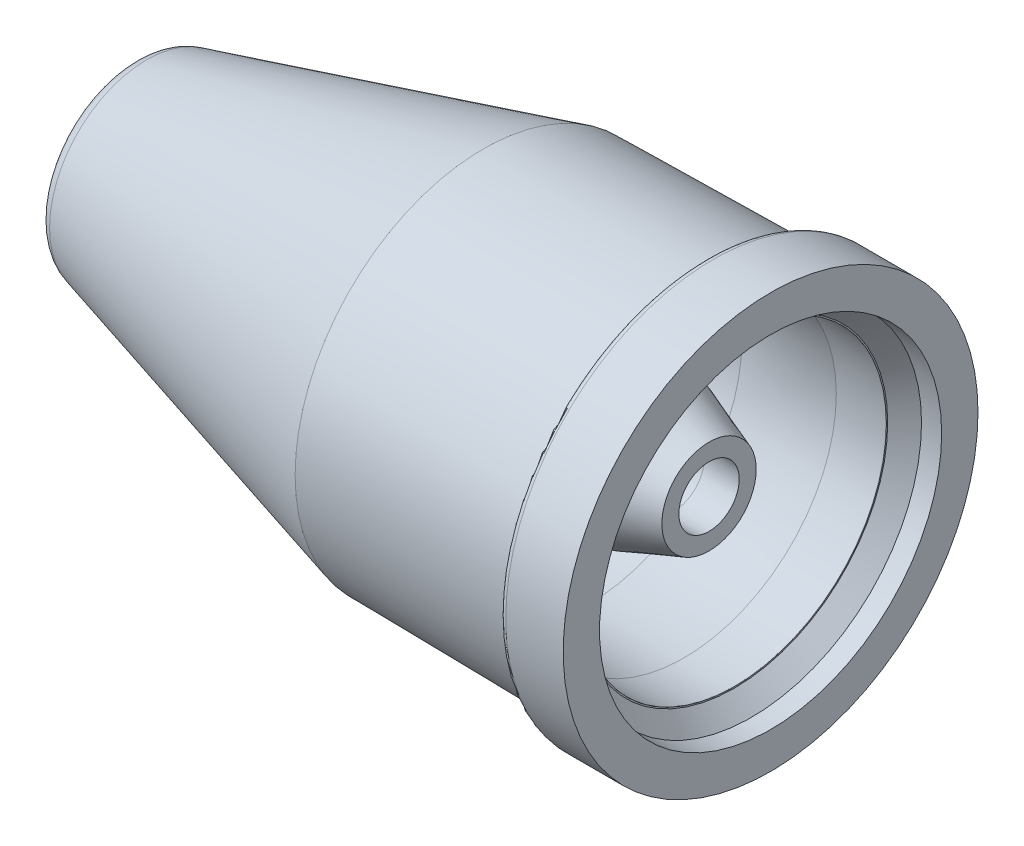
ISO-10303-21;
HEADER;
FILE_DESCRIPTION(('STEP AP214'),'2;1');
FILE_NAME('part.step','',(''),(''),'','','');
FILE_SCHEMA(('AUTOMOTIVE_DESIGN { 1 0 10303 214 1 1 1 1 }'));
ENDSEC;
DATA;
#1=APPLICATION_CONTEXT('core data for automotive mechanical design processes');
#2=APPLICATION_PROTOCOL_DEFINITION('international standard','automotive_design',2000,#1);
#3=PRODUCT_CONTEXT('',#1,'mechanical');
#4=PRODUCT('Part','Part','',(#3));
#5=PRODUCT_RELATED_PRODUCT_CATEGORY('part','',(#4));
#6=PRODUCT_DEFINITION_FORMATION('','',#4);
#7=PRODUCT_DEFINITION_CONTEXT('part definition',#1,'design');
#8=PRODUCT_DEFINITION('design','',#6,#7);
#9=PRODUCT_DEFINITION_SHAPE('','',#8);
#10=(LENGTH_UNIT() NAMED_UNIT(*) SI_UNIT(.MILLI.,.METRE.));
#11=(NAMED_UNIT(*) PLANE_ANGLE_UNIT() SI_UNIT($,.RADIAN.));
#12=(NAMED_UNIT(*) SI_UNIT($,.STERADIAN.) SOLID_ANGLE_UNIT());
#13=UNCERTAINTY_MEASURE_WITH_UNIT(LENGTH_MEASURE(1.E-05),#10,'distance_accuracy_value','');
#14=(GEOMETRIC_REPRESENTATION_CONTEXT(3) GLOBAL_UNCERTAINTY_ASSIGNED_CONTEXT((#13)) GLOBAL_UNIT_ASSIGNED_CONTEXT((#10,
#11,#12)) REPRESENTATION_CONTEXT('',''));
#15=CARTESIAN_POINT('',(0.,0.,0.));
#16=DIRECTION('',(0.,0.,1.));
#17=DIRECTION('',(1.,0.,0.));
#18=AXIS2_PLACEMENT_3D('',#15,#16,#17);
#19=CARTESIAN_POINT('',(-4.87868723113727,0.,0.));
#20=DIRECTION('',(1.,0.,0.));
#21=DIRECTION('',(0.,0.,-1.));
#22=AXIS2_PLACEMENT_3D('',#19,#20,#21);
#23=CONICAL_SURFACE('',#22,2.32622761535942,0.0125432445241696);
#24=CARTESIAN_POINT('',(-0.634642356137269,0.,0.));
#25=DIRECTION('',(1.,0.,0.));
#26=DIRECTION('',(0.,0.,-1.));
#27=AXIS2_PLACEMENT_3D('',#24,#25,#26);
#28=CIRCLE('',#27,2.3794645);
#29=CARTESIAN_POINT('',(-0.634642356137269,0.,-2.3794645));
#30=VERTEX_POINT('',#29);
#31=EDGE_CURVE('E468',#30,#30,#28,.T.);
#32=ORIENTED_EDGE('',*,*,#31,.T.);
#33=EDGE_LOOP('',(#32));
#34=FACE_BOUND('',#33,.T.);
#35=CARTESIAN_POINT('',(-0.640254310505665,0.,0.));
#36=DIRECTION('',(-1.,0.,0.));
#37=DIRECTION('',(0.,0.,1.));
#38=AXIS2_PLACEMENT_3D('',#35,#36,#37);
#39=CIRCLE('',#38,2.3793941041922);
#40=CARTESIAN_POINT('',(-0.640254310505665,0.,2.3793941041922));
#41=VERTEX_POINT('',#40);
#42=EDGE_CURVE('E441',#41,#41,#39,.T.);
#43=ORIENTED_EDGE('',*,*,#42,.T.);
#44=EDGE_LOOP('',(#43));
#45=FACE_BOUND('',#44,.T.);
#46=ADVANCED_FACE('F38',(#34,#45),#23,.F.);
#47=CARTESIAN_POINT('',(-1.59707987349605,0.,0.));
#48=DIRECTION('',(-1.,0.,0.));
#49=DIRECTION('',(0.,0.,1.));
#50=AXIS2_PLACEMENT_3D('',#47,#48,#49);
#51=CONICAL_SURFACE('',#50,0.492499997562125,0.0349065850398794);
#52=CARTESIAN_POINT('',(-1.59707987349605,0.,0.));
#53=DIRECTION('',(1.,0.,0.));
#54=DIRECTION('',(0.,0.,-1.));
#55=AXIS2_PLACEMENT_3D('',#52,#53,#54);
#56=CIRCLE('',#55,0.492499997562125);
#57=CARTESIAN_POINT('',(-1.59707987349605,0.,-0.492499997562125));
#58=VERTEX_POINT('',#57);
#59=EDGE_CURVE('E467',#58,#58,#56,.T.);
#60=ORIENTED_EDGE('',*,*,#59,.F.);
#61=EDGE_LOOP('',(#60));
#62=FACE_BOUND('',#61,.T.);
#63=CARTESIAN_POINT('',(-1.03428148113727,0.,0.));
#64=DIRECTION('',(1.,0.,0.));
#65=DIRECTION('',(0.,0.,-1.));
#66=AXIS2_PLACEMENT_3D('',#63,#64,#65);
#67=CIRCLE('',#66,0.472846644632242);
#68=CARTESIAN_POINT('',(-1.03428148113727,0.,-0.472846644632242));
#69=VERTEX_POINT('',#68);
#70=EDGE_CURVE('E438',#69,#69,#67,.T.);
#71=ORIENTED_EDGE('',*,*,#70,.T.);
#72=EDGE_LOOP('',(#71));
#73=FACE_BOUND('',#72,.T.);
#74=ADVANCED_FACE('F40',(#62,#73),#51,.F.);
#75=CARTESIAN_POINT('',(-10.0675194811373,1.4596387673665,0.));
#76=DIRECTION('',(-1.,0.,0.));
#77=DIRECTION('',(0.,0.,1.));
#78=AXIS2_PLACEMENT_3D('',#75,#76,#77);
#79=PLANE('',#78);
#80=CARTESIAN_POINT('',(-10.0675194811373,0.,0.));
#81=DIRECTION('',(-1.,0.,0.));
#82=DIRECTION('',(0.,0.,1.));
#83=AXIS2_PLACEMENT_3D('',#80,#81,#82);
#84=CIRCLE('',#83,1.23019086783449);
#85=CARTESIAN_POINT('',(-10.0675194811373,0.,1.23019086783449));
#86=VERTEX_POINT('',#85);
#87=EDGE_CURVE('E430',#86,#86,#84,.T.);
#88=ORIENTED_EDGE('',*,*,#87,.T.);
#89=EDGE_LOOP('',(#88));
#90=FACE_BOUND('',#89,.T.);
#91=CARTESIAN_POINT('',(-10.0675194811373,0.,0.));
#92=DIRECTION('',(1.,0.,0.));
#93=DIRECTION('',(0.,0.,-1.));
#94=AXIS2_PLACEMENT_3D('',#91,#92,#93);
#95=CIRCLE('',#94,1.18173405);
#96=CARTESIAN_POINT('',(-10.0675194811373,0.,-1.18173405));
#97=VERTEX_POINT('',#96);
#98=EDGE_CURVE('E58',#97,#97,#95,.T.);
#99=ORIENTED_EDGE('',*,*,#98,.T.);
#100=EDGE_LOOP('',(#99));
#101=FACE_BOUND('',#100,.T.);
#102=ADVANCED_FACE('F104',(#90,#101),#79,.T.);
#103=CARTESIAN_POINT('',(-4.56875698113727,0.,0.));
#104=DIRECTION('',(1.,0.,0.));
#105=DIRECTION('',(0.,0.,-1.));
#106=AXIS2_PLACEMENT_3D('',#103,#104,#105);
#107=CONICAL_SURFACE('',#106,2.950336025,0.264733885681429);
#108=CARTESIAN_POINT('',(-9.84606504978164,0.,0.));
#109=DIRECTION('',(-1.,0.,0.));
#110=DIRECTION('',(0.,0.,1.));
#111=AXIS2_PLACEMENT_3D('',#108,#109,#110);
#112=CIRCLE('',#111,1.51967436874274);
#113=CARTESIAN_POINT('',(-9.84606504978164,0.,1.51967436874274));
#114=VERTEX_POINT('',#113);
#115=EDGE_CURVE('E434',#114,#114,#112,.F.);
#116=ORIENTED_EDGE('',*,*,#115,.T.);
#117=EDGE_LOOP('',(#116));
#118=FACE_BOUND('',#117,.T.);
#119=CARTESIAN_POINT('',(-4.56875698113727,0.,0.));
#120=DIRECTION('',(1.,0.,0.));
#121=DIRECTION('',(0.,0.,-1.));
#122=AXIS2_PLACEMENT_3D('',#119,#120,#121);
#123=CIRCLE('',#122,2.950336025);
#124=CARTESIAN_POINT('',(-4.56875698113727,0.,-2.950336025));
#125=VERTEX_POINT('',#124);
#126=EDGE_CURVE('E436',#125,#125,#123,.T.);
#127=ORIENTED_EDGE('',*,*,#126,.F.);
#128=EDGE_LOOP('',(#127));
#129=FACE_BOUND('',#128,.T.);
#130=ADVANCED_FACE('F374',(#118,#129),#107,.T.);
#131=CARTESIAN_POINT('',(-1.06954448113727,0.,0.));
#132=DIRECTION('',(1.,0.,0.));
#133=DIRECTION('',(0.,0.,-1.));
#134=AXIS2_PLACEMENT_3D('',#131,#132,#133);
#135=CONICAL_SURFACE('',#134,2.999325,0.0139990854408832);
#136=ORIENTED_EDGE('',*,*,#126,.T.);
#137=EDGE_LOOP('',(#136));
#138=FACE_BOUND('',#137,.T.);
#139=CARTESIAN_POINT('',(-1.06954448113727,0.,0.));
#140=DIRECTION('',(1.,0.,0.));
#141=DIRECTION('',(0.,0.,-1.));
#142=AXIS2_PLACEMENT_3D('',#139,#140,#141);
#143=CIRCLE('',#142,2.999325);
#144=CARTESIAN_POINT('',(-1.06954448113727,0.,-2.999325));
#145=VERTEX_POINT('',#144);
#146=EDGE_CURVE('E451',#145,#145,#143,.T.);
#147=ORIENTED_EDGE('',*,*,#146,.F.);
#148=EDGE_LOOP('',(#147));
#149=FACE_BOUND('',#148,.T.);
#150=ADVANCED_FACE('F364',(#138,#149),#135,.T.);
#151=CARTESIAN_POINT('',(-1.06954448113727,3.24926875,0.));
#152=DIRECTION('',(-1.,0.,0.));
#153=DIRECTION('',(0.,0.,1.));
#154=AXIS2_PLACEMENT_3D('',#151,#152,#153);
#155=PLANE('',#154);
#156=CARTESIAN_POINT('',(-1.06954448113727,0.,0.));
#157=DIRECTION('',(-1.,0.,0.));
#158=DIRECTION('',(0.,0.,1.));
#159=AXIS2_PLACEMENT_3D('',#156,#157,#158);
#160=CIRCLE('',#159,3.14929125);
#161=CARTESIAN_POINT('',(-1.06954448113727,0.,3.14929125));
#162=VERTEX_POINT('',#161);
#163=EDGE_CURVE('E450',#162,#162,#160,.T.);
#164=ORIENTED_EDGE('',*,*,#163,.T.);
#165=EDGE_LOOP('',(#164));
#166=FACE_BOUND('',#165,.T.);
#167=ORIENTED_EDGE('',*,*,#146,.T.);
#168=EDGE_LOOP('',(#167));
#169=FACE_BOUND('',#168,.T.);
#170=ADVANCED_FACE('F355',(#166,#169),#155,.T.);
#171=CARTESIAN_POINT('',(2.92955551886273,0.,0.));
#172=DIRECTION('',(1.,0.,0.));
#173=DIRECTION('',(0.,0.,-1.));
#174=AXIS2_PLACEMENT_3D('',#171,#172,#173);
#175=CYLINDRICAL_SURFACE('',#174,3.24926875);
#176=CARTESIAN_POINT('',(-0.969566981137271,0.,0.));
#177=DIRECTION('',(-1.,0.,0.));
#178=DIRECTION('',(0.,0.,1.));
#179=AXIS2_PLACEMENT_3D('',#176,#177,#178);
#180=CIRCLE('',#179,3.24926875);
#181=CARTESIAN_POINT('',(-0.969566981137271,0.,3.24926875));
#182=VERTEX_POINT('',#181);
#183=EDGE_CURVE('E444',#182,#182,#180,.F.);
#184=ORIENTED_EDGE('',*,*,#183,.T.);
#185=EDGE_LOOP('',(#184));
#186=FACE_BOUND('',#185,.T.);
#187=CARTESIAN_POINT('',(-0.0697694811372708,0.,0.));
#188=DIRECTION('',(1.,0.,0.));
#189=DIRECTION('',(0.,0.,-1.));
#190=AXIS2_PLACEMENT_3D('',#187,#188,#189);
#191=CIRCLE('',#190,3.24926875);
#192=CARTESIAN_POINT('',(-0.0697694811372708,0.,-3.24926875));
#193=VERTEX_POINT('',#192);
#194=EDGE_CURVE('E454',#193,#193,#191,.T.);
#195=ORIENTED_EDGE('',*,*,#194,.F.);
#196=EDGE_LOOP('',(#195));
#197=FACE_BOUND('',#196,.T.);
#198=ADVANCED_FACE('F346',(#186,#197),#175,.T.);
#199=CARTESIAN_POINT('',(-0.0697694811372708,2.68011917125981,0.));
#200=DIRECTION('',(1.,0.,0.));
#201=DIRECTION('',(0.,0.,-1.));
#202=AXIS2_PLACEMENT_3D('',#199,#200,#201);
#203=PLANE('',#202);
#204=ORIENTED_EDGE('',*,*,#194,.T.);
#205=EDGE_LOOP('',(#204));
#206=FACE_BOUND('',#205,.T.);
#207=CARTESIAN_POINT('',(-0.0697694811372708,0.,0.));
#208=DIRECTION('',(1.,0.,0.));
#209=DIRECTION('',(0.,0.,-1.));
#210=AXIS2_PLACEMENT_3D('',#207,#208,#209);
#211=CIRCLE('',#210,2.68011917125981);
#212=CARTESIAN_POINT('',(-0.0697694811372708,0.,-2.68011917125981));
#213=VERTEX_POINT('',#212);
#214=EDGE_CURVE('E457',#213,#213,#211,.T.);
#215=ORIENTED_EDGE('',*,*,#214,.F.);
#216=EDGE_LOOP('',(#215));
#217=FACE_BOUND('',#216,.T.);
#218=ADVANCED_FACE('F337',(#206,#217),#203,.T.);
#219=CARTESIAN_POINT('',(-0.369701981137271,0.,0.));
#220=DIRECTION('',(1.,0.,0.));
#221=DIRECTION('',(0.,0.,-1.));
#222=AXIS2_PLACEMENT_3D('',#219,#220,#221);
#223=CONICAL_SURFACE('',#222,2.664400375,0.052359877559822);
#224=ORIENTED_EDGE('',*,*,#214,.T.);
#225=EDGE_LOOP('',(#224));
#226=FACE_BOUND('',#225,.T.);
#227=CARTESIAN_POINT('',(-0.369701981137271,0.,0.));
#228=DIRECTION('',(1.,0.,0.));
#229=DIRECTION('',(0.,0.,-1.));
#230=AXIS2_PLACEMENT_3D('',#227,#228,#229);
#231=CIRCLE('',#230,2.664400375);
#232=CARTESIAN_POINT('',(-0.369701981137271,0.,-2.664400375));
#233=VERTEX_POINT('',#232);
#234=EDGE_CURVE('E460',#233,#233,#231,.T.);
#235=ORIENTED_EDGE('',*,*,#234,.F.);
#236=EDGE_LOOP('',(#235));
#237=FACE_BOUND('',#236,.T.);
#238=ADVANCED_FACE('F329',(#226,#237),#223,.F.);
#239=CARTESIAN_POINT('',(-0.369701981137271,0.,0.));
#240=DIRECTION('',(1.,0.,0.));
#241=DIRECTION('',(0.,0.,-1.));
#242=AXIS2_PLACEMENT_3D('',#239,#240,#241);
#243=CONICAL_SURFACE('',#242,2.664400375,0.785398163397452);
#244=CARTESIAN_POINT('',(-0.634642356137269,0.,0.));
#245=DIRECTION('',(1.,0.,0.));
#246=DIRECTION('',(0.,0.,-1.));
#247=AXIS2_PLACEMENT_3D('',#244,#245,#246);
#248=CIRCLE('',#247,2.39946);
#249=CARTESIAN_POINT('',(-0.634642356137269,0.,-2.39946));
#250=VERTEX_POINT('',#249);
#251=EDGE_CURVE('E463',#250,#250,#248,.T.);
#252=ORIENTED_EDGE('',*,*,#251,.F.);
#253=EDGE_LOOP('',(#252));
#254=FACE_BOUND('',#253,.T.);
#255=ORIENTED_EDGE('',*,*,#234,.T.);
#256=EDGE_LOOP('',(#255));
#257=FACE_BOUND('',#256,.T.);
#258=ADVANCED_FACE('F321',(#254,#257),#243,.F.);
#259=CARTESIAN_POINT('',(-0.634642356137269,2.3794645,0.));
#260=DIRECTION('',(1.,0.,0.));
#261=DIRECTION('',(0.,0.,-1.));
#262=AXIS2_PLACEMENT_3D('',#259,#260,#261);
#263=PLANE('',#262);
#264=ORIENTED_EDGE('',*,*,#251,.T.);
#265=EDGE_LOOP('',(#264));
#266=FACE_BOUND('',#265,.T.);
#267=ORIENTED_EDGE('',*,*,#31,.F.);
#268=EDGE_LOOP('',(#267));
#269=FACE_BOUND('',#268,.T.);
#270=ADVANCED_FACE('F110',(#266,#269),#263,.T.);
#271=CARTESIAN_POINT('',(2.92955551886273,0.,0.));
#272=DIRECTION('',(1.,0.,0.));
#273=DIRECTION('',(0.,0.,-1.));
#274=AXIS2_PLACEMENT_3D('',#271,#272,#273);
#275=CYLINDRICAL_SURFACE('',#274,0.492499997562125);
#276=ORIENTED_EDGE('',*,*,#59,.T.);
#277=EDGE_LOOP('',(#276));
#278=FACE_BOUND('',#277,.T.);
#279=CARTESIAN_POINT('',(-5.92066948113727,0.,0.));
#280=DIRECTION('',(1.,0.,0.));
#281=DIRECTION('',(0.,0.,-1.));
#282=AXIS2_PLACEMENT_3D('',#279,#280,#281);
#283=CIRCLE('',#282,0.492499997562125);
#284=CARTESIAN_POINT('',(-5.92066948113727,0.,-0.492499997562125));
#285=VERTEX_POINT('',#284);
#286=EDGE_CURVE('E475',#285,#285,#283,.T.);
#287=ORIENTED_EDGE('',*,*,#286,.F.);
#288=EDGE_LOOP('',(#287));
#289=FACE_BOUND('',#288,.T.);
#290=ADVANCED_FACE('F121',(#278,#289),#275,.F.);
#291=CARTESIAN_POINT('',(-5.92066948113727,0.761902991626599,0.));
#292=DIRECTION('',(-1.,0.,0.));
#293=DIRECTION('',(0.,0.,1.));
#294=AXIS2_PLACEMENT_3D('',#291,#292,#293);
#295=PLANE('',#294);
#296=ORIENTED_EDGE('',*,*,#286,.T.);
#297=EDGE_LOOP('',(#296));
#298=FACE_BOUND('',#297,.T.);
#299=CARTESIAN_POINT('',(-5.92066948113727,0.,0.));
#300=DIRECTION('',(1.,0.,0.));
#301=DIRECTION('',(0.,0.,-1.));
#302=AXIS2_PLACEMENT_3D('',#299,#300,#301);
#303=CIRCLE('',#302,0.761902991626599);
#304=CARTESIAN_POINT('',(-5.92066948113727,0.,-0.761902991626599));
#305=VERTEX_POINT('',#304);
#306=EDGE_CURVE('E478',#305,#305,#303,.T.);
#307=ORIENTED_EDGE('',*,*,#306,.F.);
#308=EDGE_LOOP('',(#307));
#309=FACE_BOUND('',#308,.T.);
#310=ADVANCED_FACE('F124',(#298,#309),#295,.T.);
#311=CARTESIAN_POINT('',(-6.02064698113727,0.,0.));
#312=DIRECTION('',(1.,0.,0.));
#313=DIRECTION('',(0.,0.,-1.));
#314=AXIS2_PLACEMENT_3D('',#311,#312,#313);
#315=TOROIDAL_SURFACE('',#314,0.761902991626599,0.0999774999999997);
#316=CARTESIAN_POINT('',(-6.01959910326342,0.,0.));
#317=DIRECTION('',(1.,0.,0.));
#318=DIRECTION('',(0.,0.,-1.));
#319=AXIS2_PLACEMENT_3D('',#316,#317,#318);
#320=CIRCLE('',#319,0.861875);
#321=CARTESIAN_POINT('',(-6.01959910326342,0.,-0.861875));
#322=VERTEX_POINT('',#321);
#323=EDGE_CURVE('E481',#322,#322,#320,.T.);
#324=ORIENTED_EDGE('',*,*,#323,.F.);
#325=EDGE_LOOP('',(#324));
#326=FACE_BOUND('',#325,.T.);
#327=ORIENTED_EDGE('',*,*,#306,.T.);
#328=EDGE_LOOP('',(#327));
#329=FACE_BOUND('',#328,.T.);
#330=ADVANCED_FACE('F128',(#326,#329),#315,.F.);
#331=CARTESIAN_POINT('',(-9.61583788113727,0.,0.));
#332=DIRECTION('',(-1.,0.,0.));
#333=DIRECTION('',(0.,0.,1.));
#334=AXIS2_PLACEMENT_3D('',#331,#332,#333);
#335=CONICAL_SURFACE('',#334,0.910919996875,0.0136370134458708);
#336=ORIENTED_EDGE('',*,*,#323,.T.);
#337=EDGE_LOOP('',(#336));
#338=FACE_BOUND('',#337,.T.);
#339=CARTESIAN_POINT('',(-9.61583788113727,0.,0.));
#340=DIRECTION('',(1.,0.,0.));
#341=DIRECTION('',(0.,0.,-1.));
#342=AXIS2_PLACEMENT_3D('',#339,#340,#341);
#343=CIRCLE('',#342,0.910919996875);
#344=CARTESIAN_POINT('',(-9.61583788113727,0.,-0.910919996875));
#345=VERTEX_POINT('',#344);
#346=EDGE_CURVE('E484',#345,#345,#343,.T.);
#347=ORIENTED_EDGE('',*,*,#346,.F.);
#348=EDGE_LOOP('',(#347));
#349=FACE_BOUND('',#348,.T.);
#350=ADVANCED_FACE('F132',(#338,#349),#335,.F.);
#351=CARTESIAN_POINT('',(-9.61583788113727,1.01444402968771,0.));
#352=DIRECTION('',(-1.,0.,0.));
#353=DIRECTION('',(0.,0.,1.));
#354=AXIS2_PLACEMENT_3D('',#351,#352,#353);
#355=PLANE('',#354);
#356=ORIENTED_EDGE('',*,*,#346,.T.);
#357=EDGE_LOOP('',(#356));
#358=FACE_BOUND('',#357,.T.);
#359=CARTESIAN_POINT('',(-9.61583788113727,0.,0.));
#360=DIRECTION('',(1.,0.,0.));
#361=DIRECTION('',(0.,0.,-1.));
#362=AXIS2_PLACEMENT_3D('',#359,#360,#361);
#363=CIRCLE('',#362,1.01444402968771);
#364=CARTESIAN_POINT('',(-9.61583788113727,0.,-1.01444402968771));
#365=VERTEX_POINT('',#364);
#366=EDGE_CURVE('E487',#365,#365,#363,.T.);
#367=ORIENTED_EDGE('',*,*,#366,.F.);
#368=EDGE_LOOP('',(#367));
#369=FACE_BOUND('',#368,.T.);
#370=ADVANCED_FACE('F136',(#358,#369),#355,.T.);
#371=CARTESIAN_POINT('',(-9.71581538113727,0.,0.));
#372=DIRECTION('',(1.,0.,0.));
#373=DIRECTION('',(0.,0.,-1.));
#374=AXIS2_PLACEMENT_3D('',#371,#372,#373);
#375=TOROIDAL_SURFACE('',#374,1.01444402968771,0.0999774999999997);
#376=ORIENTED_EDGE('',*,*,#366,.T.);
#377=EDGE_LOOP('',(#376));
#378=FACE_BOUND('',#377,.T.);
#379=CARTESIAN_POINT('',(-9.69425841417917,0.,0.));
#380=DIRECTION('',(1.,0.,0.));
#381=DIRECTION('',(0.,0.,-1.));
#382=AXIS2_PLACEMENT_3D('',#379,#380,#381);
#383=CIRCLE('',#382,1.1120698340727);
#384=CARTESIAN_POINT('',(-9.69425841417917,0.,-1.1120698340727));
#385=VERTEX_POINT('',#384);
#386=EDGE_CURVE('E491',#385,#385,#383,.T.);
#387=ORIENTED_EDGE('',*,*,#386,.F.);
#388=EDGE_LOOP('',(#387));
#389=FACE_BOUND('',#388,.T.);
#390=ADVANCED_FACE('F140',(#378,#389),#375,.F.);
#391=CARTESIAN_POINT('',(-10.0097492311373,0.,0.));
#392=DIRECTION('',(-1.,0.,0.));
#393=DIRECTION('',(0.,0.,1.));
#394=AXIS2_PLACEMENT_3D('',#391,#392,#393);
#395=CONICAL_SURFACE('',#394,1.18173405,0.217324860661831);
#396=ORIENTED_EDGE('',*,*,#386,.T.);
#397=EDGE_LOOP('',(#396));
#398=FACE_BOUND('',#397,.T.);
#399=CARTESIAN_POINT('',(-10.0097492311373,0.,0.));
#400=DIRECTION('',(1.,0.,0.));
#401=DIRECTION('',(0.,0.,-1.));
#402=AXIS2_PLACEMENT_3D('',#399,#400,#401);
#403=CIRCLE('',#402,1.18173405);
#404=CARTESIAN_POINT('',(-10.0097492311373,0.,-1.18173405));
#405=VERTEX_POINT('',#404);
#406=EDGE_CURVE('E70',#405,#405,#403,.T.);
#407=ORIENTED_EDGE('',*,*,#406,.F.);
#408=EDGE_LOOP('',(#407));
#409=FACE_BOUND('',#408,.T.);
#410=ADVANCED_FACE('F144',(#398,#409),#395,.F.);
#411=CARTESIAN_POINT('',(2.92955551886273,0.,0.));
#412=DIRECTION('',(1.,0.,0.));
#413=DIRECTION('',(0.,0.,-1.));
#414=AXIS2_PLACEMENT_3D('',#411,#412,#413);
#415=CYLINDRICAL_SURFACE('',#414,1.18173405);
#416=ORIENTED_EDGE('',*,*,#406,.T.);
#417=EDGE_LOOP('',(#416));
#418=FACE_BOUND('',#417,.T.);
#419=ORIENTED_EDGE('',*,*,#98,.F.);
#420=EDGE_LOOP('',(#419));
#421=FACE_BOUND('',#420,.T.);
#422=ADVANCED_FACE('F148',(#418,#421),#415,.F.);
#423=CARTESIAN_POINT('',(-9.76758698113727,0.,0.));
#424=DIRECTION('',(-1.,0.,0.));
#425=DIRECTION('',(0.,0.,1.));
#426=AXIS2_PLACEMENT_3D('',#423,#424,#425);
#427=TOROIDAL_SURFACE('',#426,1.23019086783449,0.2999325);
#428=ORIENTED_EDGE('',*,*,#87,.F.);
#429=EDGE_LOOP('',(#428));
#430=FACE_BOUND('',#429,.T.);
#431=ORIENTED_EDGE('',*,*,#115,.F.);
#432=EDGE_LOOP('',(#431));
#433=FACE_BOUND('',#432,.T.);
#434=ADVANCED_FACE('F151',(#430,#433),#427,.T.);
#435=CARTESIAN_POINT('',(-0.969566981137271,0.,0.));
#436=DIRECTION('',(-1.,0.,0.));
#437=DIRECTION('',(0.,0.,1.));
#438=AXIS2_PLACEMENT_3D('',#435,#436,#437);
#439=TOROIDAL_SURFACE('',#438,3.14929125,0.0999775);
#440=ORIENTED_EDGE('',*,*,#163,.F.);
#441=EDGE_LOOP('',(#440));
#442=FACE_BOUND('',#441,.T.);
#443=ORIENTED_EDGE('',*,*,#183,.F.);
#444=EDGE_LOOP('',(#443));
#445=FACE_BOUND('',#444,.T.);
#446=ADVANCED_FACE('F168',(#442,#445),#439,.T.);
#447=CARTESIAN_POINT('',(-1.94088034262183,0.,0.));
#448=DIRECTION('',(-1.,0.,0.));
#449=DIRECTION('',(0.,0.,1.));
#450=AXIS2_PLACEMENT_3D('',#447,#448,#449);
#451=CONICAL_SURFACE('',#450,1.068725,0.0115615316200557);
#452=CARTESIAN_POINT('',(-5.34858148113727,0.,0.));
#453=DIRECTION('',(1.,0.,0.));
#454=DIRECTION('',(0.,0.,-1.));
#455=AXIS2_PLACEMENT_3D('',#452,#453,#454);
#456=CIRCLE('',#455,1.108125);
#457=CARTESIAN_POINT('',(-5.34858148113727,0.,-1.108125));
#458=VERTEX_POINT('',#457);
#459=EDGE_CURVE('E67',#458,#458,#456,.T.);
#460=ORIENTED_EDGE('',*,*,#459,.T.);
#461=EDGE_LOOP('',(#460));
#462=FACE_BOUND('',#461,.T.);
#463=CARTESIAN_POINT('',(-1.94088034262183,0.,0.));
#464=DIRECTION('',(1.,0.,0.));
#465=DIRECTION('',(0.,0.,-1.));
#466=AXIS2_PLACEMENT_3D('',#463,#464,#465);
#467=CIRCLE('',#466,1.068725);
#468=CARTESIAN_POINT('',(-1.94088034262183,0.,-1.068725));
#469=VERTEX_POINT('',#468);
#470=EDGE_CURVE('E64',#469,#469,#467,.T.);
#471=ORIENTED_EDGE('',*,*,#470,.F.);
#472=EDGE_LOOP('',(#471));
#473=FACE_BOUND('',#472,.T.);
#474=ADVANCED_FACE('F164',(#462,#473),#451,.T.);
#475=CARTESIAN_POINT('',(-1.03428148113727,0.,0.));
#476=DIRECTION('',(-1.,0.,0.));
#477=DIRECTION('',(0.,0.,1.));
#478=AXIS2_PLACEMENT_3D('',#475,#476,#477);
#479=CONICAL_SURFACE('',#478,0.738750000000001,0.34906585039886);
#480=ORIENTED_EDGE('',*,*,#470,.T.);
#481=EDGE_LOOP('',(#480));
#482=FACE_BOUND('',#481,.T.);
#483=CARTESIAN_POINT('',(-1.03428148113727,0.,0.));
#484=DIRECTION('',(1.,0.,0.));
#485=DIRECTION('',(0.,0.,-1.));
#486=AXIS2_PLACEMENT_3D('',#483,#484,#485);
#487=CIRCLE('',#486,0.738750000000001);
#488=CARTESIAN_POINT('',(-1.03428148113727,0.,-0.738750000000001));
#489=VERTEX_POINT('',#488);
#490=EDGE_CURVE('E60',#489,#489,#487,.T.);
#491=ORIENTED_EDGE('',*,*,#490,.F.);
#492=EDGE_LOOP('',(#491));
#493=FACE_BOUND('',#492,.T.);
#494=ADVANCED_FACE('F160',(#482,#493),#479,.T.);
#495=CARTESIAN_POINT('',(-1.03428148113727,-0.472800000000001,0.));
#496=DIRECTION('',(1.,0.,0.));
#497=DIRECTION('',(0.,0.,-1.));
#498=AXIS2_PLACEMENT_3D('',#495,#496,#497);
#499=PLANE('',#498);
#500=ORIENTED_EDGE('',*,*,#70,.F.);
#501=EDGE_LOOP('',(#500));
#502=FACE_BOUND('',#501,.T.);
#503=ORIENTED_EDGE('',*,*,#490,.T.);
#504=EDGE_LOOP('',(#503));
#505=FACE_BOUND('',#504,.T.);
#506=ADVANCED_FACE('F116',(#502,#505),#499,.T.);
#507=CARTESIAN_POINT('',(2.92955551886273,0.,0.));
#508=DIRECTION('',(1.,0.,0.));
#509=DIRECTION('',(0.,0.,-1.));
#510=AXIS2_PLACEMENT_3D('',#507,#508,#509);
#511=CYLINDRICAL_SURFACE('',#510,1.474668125);
#512=CARTESIAN_POINT('',(-5.76228148113727,0.,0.));
#513=DIRECTION('',(1.,0.,0.));
#514=DIRECTION('',(0.,0.,-1.));
#515=AXIS2_PLACEMENT_3D('',#512,#513,#514);
#516=CIRCLE('',#515,1.474668125);
#517=CARTESIAN_POINT('',(-5.76228148113727,0.,-1.474668125));
#518=VERTEX_POINT('',#517);
#519=EDGE_CURVE('E470',#518,#518,#516,.T.);
#520=ORIENTED_EDGE('',*,*,#519,.T.);
#521=EDGE_LOOP('',(#520));
#522=FACE_BOUND('',#521,.T.);
#523=CARTESIAN_POINT('',(-5.34858148113727,0.,0.));
#524=DIRECTION('',(1.,0.,0.));
#525=DIRECTION('',(0.,0.,-1.));
#526=AXIS2_PLACEMENT_3D('',#523,#524,#525);
#527=CIRCLE('',#526,1.474668125);
#528=CARTESIAN_POINT('',(-5.34858148113727,0.,-1.474668125));
#529=VERTEX_POINT('',#528);
#530=EDGE_CURVE('E63',#529,#529,#527,.T.);
#531=ORIENTED_EDGE('',*,*,#530,.F.);
#532=EDGE_LOOP('',(#531));
#533=FACE_BOUND('',#532,.T.);
#534=ADVANCED_FACE('F112',(#522,#533),#511,.T.);
#535=CARTESIAN_POINT('',(-5.34858148113727,1.108125,0.));
#536=DIRECTION('',(1.,0.,0.));
#537=DIRECTION('',(0.,0.,-1.));
#538=AXIS2_PLACEMENT_3D('',#535,#536,#537);
#539=PLANE('',#538);
#540=ORIENTED_EDGE('',*,*,#459,.F.);
#541=EDGE_LOOP('',(#540));
#542=FACE_BOUND('',#541,.T.);
#543=ORIENTED_EDGE('',*,*,#530,.T.);
#544=EDGE_LOOP('',(#543));
#545=FACE_BOUND('',#544,.T.);
#546=ADVANCED_FACE('F115',(#542,#545),#539,.T.);
#547=CARTESIAN_POINT('',(-0.0697694811372708,0.,0.));
#548=DIRECTION('',(1.,0.,0.));
#549=DIRECTION('',(0.,0.,-1.));
#550=AXIS2_PLACEMENT_3D('',#547,#548,#549);
#551=CYLINDRICAL_SURFACE('',#550,2.388625);
#552=CARTESIAN_POINT('',(-2.90641857222749,0.,0.));
#553=DIRECTION('',(1.,0.,0.));
#554=DIRECTION('',(0.,0.,-1.));
#555=AXIS2_PLACEMENT_3D('',#552,#553,#554);
#556=CIRCLE('',#555,2.388625);
#557=CARTESIAN_POINT('',(-2.90641857222749,0.,-2.388625));
#558=VERTEX_POINT('',#557);
#559=EDGE_CURVE('E74',#558,#558,#556,.T.);
#560=ORIENTED_EDGE('',*,*,#559,.T.);
#561=EDGE_LOOP('',(#560));
#562=FACE_BOUND('',#561,.T.);
#563=CARTESIAN_POINT('',(-4.88563148113727,0.,0.));
#564=DIRECTION('',(1.,0.,0.));
#565=DIRECTION('',(0.,0.,-1.));
#566=AXIS2_PLACEMENT_3D('',#563,#564,#565);
#567=CIRCLE('',#566,2.388625);
#568=CARTESIAN_POINT('',(-4.88563148113727,0.,-2.388625));
#569=VERTEX_POINT('',#568);
#570=EDGE_CURVE('E54',#569,#569,#567,.T.);
#571=ORIENTED_EDGE('',*,*,#570,.F.);
#572=EDGE_LOOP('',(#571));
#573=FACE_BOUND('',#572,.T.);
#574=ADVANCED_FACE('F82',(#562,#573),#551,.F.);
#575=CARTESIAN_POINT('',(-4.9803157581872,0.,0.));
#576=DIRECTION('',(1.,0.,0.));
#577=DIRECTION('',(0.,0.,-1.));
#578=AXIS2_PLACEMENT_3D('',#575,#576,#577);
#579=CONICAL_SURFACE('',#578,2.36147472045203,0.27925268031909);
#580=ORIENTED_EDGE('',*,*,#570,.T.);
#581=EDGE_LOOP('',(#580));
#582=FACE_BOUND('',#581,.T.);
#583=CARTESIAN_POINT('',(-4.9803157581872,0.,0.));
#584=DIRECTION('',(1.,0.,0.));
#585=DIRECTION('',(0.,0.,-1.));
#586=AXIS2_PLACEMENT_3D('',#583,#584,#585);
#587=CIRCLE('',#586,2.36147472045203);
#588=CARTESIAN_POINT('',(-4.9803157581872,0.,-2.36147472045203));
#589=VERTEX_POINT('',#588);
#590=EDGE_CURVE('E49',#589,#589,#587,.T.);
#591=ORIENTED_EDGE('',*,*,#590,.F.);
#592=EDGE_LOOP('',(#591));
#593=FACE_BOUND('',#592,.T.);
#594=ADVANCED_FACE('F88',(#582,#593),#579,.F.);
#595=CARTESIAN_POINT('',(-2.16766857222749,0.,0.));
#596=DIRECTION('',(1.,0.,0.));
#597=DIRECTION('',(0.,0.,-1.));
#598=AXIS2_PLACEMENT_3D('',#595,#596,#597);
#599=TOROIDAL_SURFACE('',#598,7.90462499999998,5.56524999999998);
#600=ORIENTED_EDGE('',*,*,#559,.F.);
#601=EDGE_LOOP('',(#600));
#602=FACE_BOUND('',#601,.T.);
#603=CARTESIAN_POINT('',(-1.42891857222749,0.,0.));
#604=DIRECTION('',(1.,0.,0.));
#605=DIRECTION('',(0.,0.,-1.));
#606=AXIS2_PLACEMENT_3D('',#603,#604,#605);
#607=CIRCLE('',#606,2.388625);
#608=CARTESIAN_POINT('',(-1.42891857222749,0.,-2.388625));
#609=VERTEX_POINT('',#608);
#610=EDGE_CURVE('E10',#609,#609,#607,.T.);
#611=ORIENTED_EDGE('',*,*,#610,.T.);
#612=EDGE_LOOP('',(#611));
#613=FACE_BOUND('',#612,.T.);
#614=ADVANCED_FACE('F85',(#602,#613),#599,.T.);
#615=CARTESIAN_POINT('',(-0.0697694811372708,0.,0.));
#616=DIRECTION('',(1.,0.,0.));
#617=DIRECTION('',(0.,0.,-1.));
#618=AXIS2_PLACEMENT_3D('',#615,#616,#617);
#619=CYLINDRICAL_SURFACE('',#618,2.388625);
#620=CARTESIAN_POINT('',(-0.640281481137273,0.,0.));
#621=DIRECTION('',(1.,0.,0.));
#622=DIRECTION('',(0.,0.,-1.));
#623=AXIS2_PLACEMENT_3D('',#620,#621,#622);
#624=CIRCLE('',#623,2.388625);
#625=CARTESIAN_POINT('',(-0.640281481137273,0.,-2.388625));
#626=VERTEX_POINT('',#625);
#627=EDGE_CURVE('E45',#626,#626,#624,.T.);
#628=ORIENTED_EDGE('',*,*,#627,.T.);
#629=EDGE_LOOP('',(#628));
#630=FACE_BOUND('',#629,.T.);
#631=ORIENTED_EDGE('',*,*,#610,.F.);
#632=EDGE_LOOP('',(#631));
#633=FACE_BOUND('',#632,.T.);
#634=ADVANCED_FACE('F87',(#630,#633),#619,.F.);
#635=CARTESIAN_POINT('',(-0.640281481137273,0.,0.));
#636=DIRECTION('',(-1.,0.,0.));
#637=DIRECTION('',(0.,0.,1.));
#638=AXIS2_PLACEMENT_3D('',#635,#636,#637);
#639=CONICAL_SURFACE('',#638,2.388625,1.56785289056531);
#640=ORIENTED_EDGE('',*,*,#42,.F.);
#641=EDGE_LOOP('',(#640));
#642=FACE_BOUND('',#641,.T.);
#643=ORIENTED_EDGE('',*,*,#627,.F.);
#644=EDGE_LOOP('',(#643));
#645=FACE_BOUND('',#644,.T.);
#646=ADVANCED_FACE('F93',(#642,#645),#639,.F.);
#647=CARTESIAN_POINT('',(-5.76228148113727,-1.4775,0.));
#648=DIRECTION('',(1.,0.,0.));
#649=DIRECTION('',(0.,0.,-1.));
#650=AXIS2_PLACEMENT_3D('',#647,#648,#649);
#651=PLANE('',#650);
#652=CARTESIAN_POINT('',(-5.76228148113727,0.,0.));
#653=DIRECTION('',(1.,0.,0.));
#654=DIRECTION('',(0.,0.,-1.));
#655=AXIS2_PLACEMENT_3D('',#652,#653,#654);
#656=CIRCLE('',#655,2.13724965757454);
#657=CARTESIAN_POINT('',(-5.76228148113727,0.,-2.13724965757454));
#658=VERTEX_POINT('',#657);
#659=EDGE_CURVE('E71',#658,#658,#656,.T.);
#660=ORIENTED_EDGE('',*,*,#659,.T.);
#661=EDGE_LOOP('',(#660));
#662=FACE_BOUND('',#661,.T.);
#663=ORIENTED_EDGE('',*,*,#519,.F.);
#664=EDGE_LOOP('',(#663));
#665=FACE_BOUND('',#664,.T.);
#666=ADVANCED_FACE('F156',(#662,#665),#651,.T.);
#667=CARTESIAN_POINT('',(-5.76228148113727,0.,0.));
#668=DIRECTION('',(1.,0.,0.));
#669=DIRECTION('',(0.,0.,-1.));
#670=AXIS2_PLACEMENT_3D('',#667,#668,#669);
#671=CONICAL_SURFACE('',#670,2.13724965757454,0.27925268031908);
#672=CARTESIAN_POINT('',(-5.64310569753667,0.,0.));
#673=DIRECTION('',(1.,0.,0.));
#674=DIRECTION('',(0.,0.,-1.));
#675=AXIS2_PLACEMENT_3D('',#672,#673,#674);
#676=CIRCLE('',#675,2.17142276361621);
#677=CARTESIAN_POINT('',(-5.64310569753667,0.,-2.17142276361621));
#678=VERTEX_POINT('',#677);
#679=EDGE_CURVE('E75',#678,#678,#676,.T.);
#680=ORIENTED_EDGE('',*,*,#679,.T.);
#681=EDGE_LOOP('',(#680));
#682=FACE_BOUND('',#681,.T.);
#683=ORIENTED_EDGE('',*,*,#659,.F.);
#684=EDGE_LOOP('',(#683));
#685=FACE_BOUND('',#684,.T.);
#686=ADVANCED_FACE('F172',(#682,#685),#671,.F.);
#687=CARTESIAN_POINT('',(-5.40865661696533,0.,0.));
#688=DIRECTION('',(1.,0.,0.));
#689=DIRECTION('',(0.,0.,-1.));
#690=AXIS2_PLACEMENT_3D('',#687,#688,#689);
#691=TOROIDAL_SURFACE('',#690,2.60453923596429,0.492499999999999);
#692=ORIENTED_EDGE('',*,*,#679,.F.);
#693=EDGE_LOOP('',(#692));
#694=FACE_BOUND('',#693,.T.);
#695=ORIENTED_EDGE('',*,*,#590,.T.);
#696=EDGE_LOOP('',(#695));
#697=FACE_BOUND('',#696,.T.);
#698=ADVANCED_FACE('F176',(#694,#697),#691,.T.);
#699=CLOSED_SHELL('',(#46,#74,#102,#130,#150,#170,#198,#218,#238,#258,#270,#290,#310,#330,#350,
#370,#390,#410,#422,#434,#446,#474,#494,#506,#534,#546,#574,#594,#614,#634,#646,#666,#686,#698));
#700=MANIFOLD_SOLID_BREP('B2',#699);
#701=ADVANCED_BREP_SHAPE_REPRESENTATION('',(#18,#700),#14);
#702=SHAPE_DEFINITION_REPRESENTATION(#9,#701);
ENDSEC;
END-ISO-10303-21;
